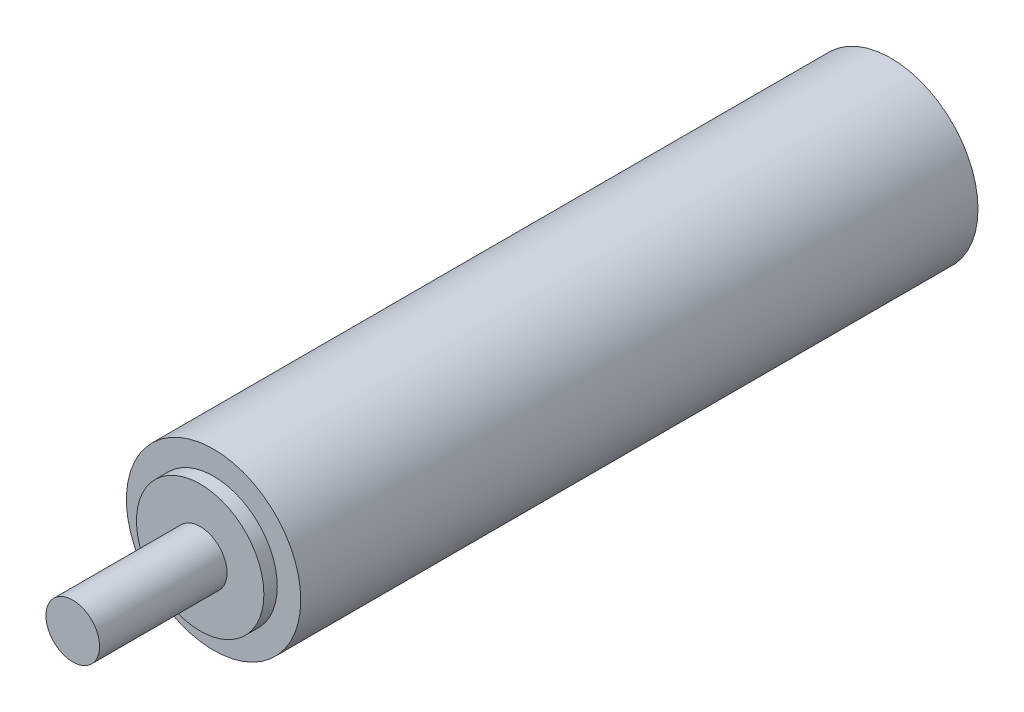
ISO-10303-21;
HEADER;
FILE_DESCRIPTION(('STEP AP214'),'2;1');
FILE_NAME('part.step','',(''),(''),'','','');
FILE_SCHEMA(('AUTOMOTIVE_DESIGN { 1 0 10303 214 1 1 1 1 }'));
ENDSEC;
DATA;
#1=APPLICATION_CONTEXT('core data for automotive mechanical design processes');
#2=APPLICATION_PROTOCOL_DEFINITION('international standard','automotive_design',2000,#1);
#3=PRODUCT_CONTEXT('',#1,'mechanical');
#4=PRODUCT('Part','Part','',(#3));
#5=PRODUCT_RELATED_PRODUCT_CATEGORY('part','',(#4));
#6=PRODUCT_DEFINITION_FORMATION('','',#4);
#7=PRODUCT_DEFINITION_CONTEXT('part definition',#1,'design');
#8=PRODUCT_DEFINITION('design','',#6,#7);
#9=PRODUCT_DEFINITION_SHAPE('','',#8);
#10=(LENGTH_UNIT() NAMED_UNIT(*) SI_UNIT(.MILLI.,.METRE.));
#11=(NAMED_UNIT(*) PLANE_ANGLE_UNIT() SI_UNIT($,.RADIAN.));
#12=(NAMED_UNIT(*) SI_UNIT($,.STERADIAN.) SOLID_ANGLE_UNIT());
#13=UNCERTAINTY_MEASURE_WITH_UNIT(LENGTH_MEASURE(1.E-05),#10,'distance_accuracy_value','');
#14=(GEOMETRIC_REPRESENTATION_CONTEXT(3) GLOBAL_UNCERTAINTY_ASSIGNED_CONTEXT((#13)) GLOBAL_UNIT_ASSIGNED_CONTEXT((#10,
#11,#12)) REPRESENTATION_CONTEXT('',''));
#15=CARTESIAN_POINT('',(0.,0.,0.));
#16=DIRECTION('',(0.,0.,1.));
#17=DIRECTION('',(1.,0.,0.));
#18=AXIS2_PLACEMENT_3D('',#15,#16,#17);
#19=CARTESIAN_POINT('',(0.,0.,101.));
#20=DIRECTION('',(0.,0.,-1.));
#21=DIRECTION('',(-1.,0.,0.));
#22=AXIS2_PLACEMENT_3D('',#19,#20,#21);
#23=CYLINDRICAL_SURFACE('',#22,13.);
#24=CARTESIAN_POINT('',(0.,0.,101.));
#25=DIRECTION('',(0.,0.,1.));
#26=DIRECTION('',(1.,0.,0.));
#27=AXIS2_PLACEMENT_3D('',#24,#25,#26);
#28=CIRCLE('',#27,13.);
#29=CARTESIAN_POINT('',(13.,0.,101.));
#30=VERTEX_POINT('',#29);
#31=EDGE_CURVE('E43',#30,#30,#28,.T.);
#32=ORIENTED_EDGE('',*,*,#31,.F.);
#33=EDGE_LOOP('',(#32));
#34=FACE_BOUND('',#33,.T.);
#35=CARTESIAN_POINT('',(0.,0.,0.));
#36=DIRECTION('',(0.,0.,1.));
#37=DIRECTION('',(1.,0.,0.));
#38=AXIS2_PLACEMENT_3D('',#35,#36,#37);
#39=CIRCLE('',#38,13.);
#40=CARTESIAN_POINT('',(13.,0.,0.));
#41=VERTEX_POINT('',#40);
#42=EDGE_CURVE('E34',#41,#41,#39,.T.);
#43=ORIENTED_EDGE('',*,*,#42,.T.);
#44=EDGE_LOOP('',(#43));
#45=FACE_BOUND('',#44,.T.);
#46=ADVANCED_FACE('F31',(#34,#45),#23,.T.);
#47=CARTESIAN_POINT('',(0.,0.,101.));
#48=DIRECTION('',(0.,0.,1.));
#49=DIRECTION('',(1.,0.,0.));
#50=AXIS2_PLACEMENT_3D('',#47,#48,#49);
#51=PLANE('',#50);
#52=CARTESIAN_POINT('',(0.,0.,101.));
#53=DIRECTION('',(0.,0.,1.));
#54=DIRECTION('',(1.,0.,0.));
#55=AXIS2_PLACEMENT_3D('',#52,#53,#54);
#56=CIRCLE('',#55,9.5);
#57=CARTESIAN_POINT('',(9.5,0.,101.));
#58=VERTEX_POINT('',#57);
#59=EDGE_CURVE('E38',#58,#58,#56,.T.);
#60=ORIENTED_EDGE('',*,*,#59,.F.);
#61=EDGE_LOOP('',(#60));
#62=FACE_BOUND('',#61,.T.);
#63=ORIENTED_EDGE('',*,*,#31,.T.);
#64=EDGE_LOOP('',(#63));
#65=FACE_BOUND('',#64,.T.);
#66=ADVANCED_FACE('F60',(#62,#65),#51,.T.);
#67=CARTESIAN_POINT('',(0.,0.,0.));
#68=DIRECTION('',(0.,0.,1.));
#69=DIRECTION('',(1.,0.,0.));
#70=AXIS2_PLACEMENT_3D('',#67,#68,#69);
#71=PLANE('',#70);
#72=ORIENTED_EDGE('',*,*,#42,.F.);
#73=EDGE_LOOP('',(#72));
#74=FACE_BOUND('',#73,.T.);
#75=ADVANCED_FACE('F57',(#74),#71,.F.);
#76=CARTESIAN_POINT('',(0.,0.,103.));
#77=DIRECTION('',(0.,0.,-1.));
#78=DIRECTION('',(-1.,0.,0.));
#79=AXIS2_PLACEMENT_3D('',#76,#77,#78);
#80=CYLINDRICAL_SURFACE('',#79,9.5);
#81=CARTESIAN_POINT('',(0.,0.,103.));
#82=DIRECTION('',(0.,0.,1.));
#83=DIRECTION('',(1.,0.,0.));
#84=AXIS2_PLACEMENT_3D('',#81,#82,#83);
#85=CIRCLE('',#84,9.5);
#86=CARTESIAN_POINT('',(9.5,0.,103.));
#87=VERTEX_POINT('',#86);
#88=EDGE_CURVE('E48',#87,#87,#85,.T.);
#89=ORIENTED_EDGE('',*,*,#88,.F.);
#90=EDGE_LOOP('',(#89));
#91=FACE_BOUND('',#90,.T.);
#92=ORIENTED_EDGE('',*,*,#59,.T.);
#93=EDGE_LOOP('',(#92));
#94=FACE_BOUND('',#93,.T.);
#95=ADVANCED_FACE('F59',(#91,#94),#80,.T.);
#96=CARTESIAN_POINT('',(0.,0.,103.));
#97=DIRECTION('',(0.,0.,1.));
#98=DIRECTION('',(1.,0.,0.));
#99=AXIS2_PLACEMENT_3D('',#96,#97,#98);
#100=PLANE('',#99);
#101=CARTESIAN_POINT('',(0.,0.,103.));
#102=DIRECTION('',(0.,0.,1.));
#103=DIRECTION('',(1.,0.,0.));
#104=AXIS2_PLACEMENT_3D('',#101,#102,#103);
#105=CIRCLE('',#104,4.);
#106=CARTESIAN_POINT('',(4.,0.,103.));
#107=VERTEX_POINT('',#106);
#108=EDGE_CURVE('E10',#107,#107,#105,.T.);
#109=ORIENTED_EDGE('',*,*,#108,.F.);
#110=EDGE_LOOP('',(#109));
#111=FACE_BOUND('',#110,.T.);
#112=ORIENTED_EDGE('',*,*,#88,.T.);
#113=EDGE_LOOP('',(#112));
#114=FACE_BOUND('',#113,.T.);
#115=ADVANCED_FACE('F65',(#111,#114),#100,.T.);
#116=CARTESIAN_POINT('',(0.,0.,122.));
#117=DIRECTION('',(0.,0.,-1.));
#118=DIRECTION('',(-1.,0.,0.));
#119=AXIS2_PLACEMENT_3D('',#116,#117,#118);
#120=CYLINDRICAL_SURFACE('',#119,4.);
#121=CARTESIAN_POINT('',(0.,0.,122.));
#122=DIRECTION('',(0.,0.,1.));
#123=DIRECTION('',(1.,0.,0.));
#124=AXIS2_PLACEMENT_3D('',#121,#122,#123);
#125=CIRCLE('',#124,4.);
#126=CARTESIAN_POINT('',(4.,0.,122.));
#127=VERTEX_POINT('',#126);
#128=EDGE_CURVE('E47',#127,#127,#125,.T.);
#129=ORIENTED_EDGE('',*,*,#128,.F.);
#130=EDGE_LOOP('',(#129));
#131=FACE_BOUND('',#130,.T.);
#132=ORIENTED_EDGE('',*,*,#108,.T.);
#133=EDGE_LOOP('',(#132));
#134=FACE_BOUND('',#133,.T.);
#135=ADVANCED_FACE('F95',(#131,#134),#120,.T.);
#136=CARTESIAN_POINT('',(0.,0.,122.));
#137=DIRECTION('',(0.,0.,1.));
#138=DIRECTION('',(1.,0.,0.));
#139=AXIS2_PLACEMENT_3D('',#136,#137,#138);
#140=PLANE('',#139);
#141=ORIENTED_EDGE('',*,*,#128,.T.);
#142=EDGE_LOOP('',(#141));
#143=FACE_BOUND('',#142,.T.);
#144=ADVANCED_FACE('F105',(#143),#140,.T.);
#145=CLOSED_SHELL('',(#46,#66,#75,#95,#115,#135,#144));
#146=MANIFOLD_SOLID_BREP('B2',#145);
#147=ADVANCED_BREP_SHAPE_REPRESENTATION('',(#18,#146),#14);
#148=SHAPE_DEFINITION_REPRESENTATION(#9,#147);
ENDSEC;
END-ISO-10303-21;
